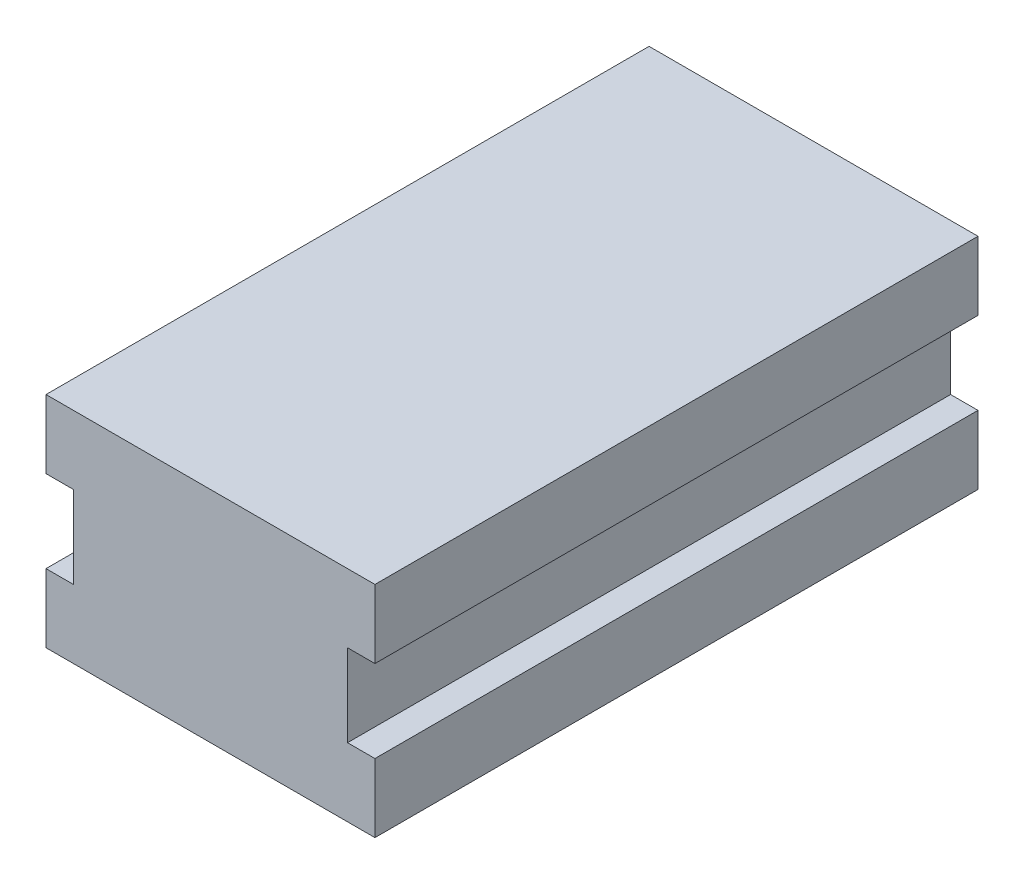
ISO-10303-21;
HEADER;
FILE_DESCRIPTION(('STEP AP214'),'2;1');
FILE_NAME('part.step','',(''),(''),'','','');
FILE_SCHEMA(('AUTOMOTIVE_DESIGN { 1 0 10303 214 1 1 1 1 }'));
ENDSEC;
DATA;
#1=APPLICATION_CONTEXT('core data for automotive mechanical design processes');
#2=APPLICATION_PROTOCOL_DEFINITION('international standard','automotive_design',2000,#1);
#3=PRODUCT_CONTEXT('',#1,'mechanical');
#4=PRODUCT('Part','Part','',(#3));
#5=PRODUCT_RELATED_PRODUCT_CATEGORY('part','',(#4));
#6=PRODUCT_DEFINITION_FORMATION('','',#4);
#7=PRODUCT_DEFINITION_CONTEXT('part definition',#1,'design');
#8=PRODUCT_DEFINITION('design','',#6,#7);
#9=PRODUCT_DEFINITION_SHAPE('','',#8);
#10=(LENGTH_UNIT() NAMED_UNIT(*) SI_UNIT(.MILLI.,.METRE.));
#11=(NAMED_UNIT(*) PLANE_ANGLE_UNIT() SI_UNIT($,.RADIAN.));
#12=(NAMED_UNIT(*) SI_UNIT($,.STERADIAN.) SOLID_ANGLE_UNIT());
#13=UNCERTAINTY_MEASURE_WITH_UNIT(LENGTH_MEASURE(1.E-05),#10,'distance_accuracy_value','');
#14=(GEOMETRIC_REPRESENTATION_CONTEXT(3) GLOBAL_UNCERTAINTY_ASSIGNED_CONTEXT((#13)) GLOBAL_UNIT_ASSIGNED_CONTEXT((#10,
#11,#12)) REPRESENTATION_CONTEXT('',''));
#15=CARTESIAN_POINT('',(0.,0.,0.));
#16=DIRECTION('',(0.,0.,1.));
#17=DIRECTION('',(1.,0.,0.));
#18=AXIS2_PLACEMENT_3D('',#15,#16,#17);
#19=CARTESIAN_POINT('',(0.,2.5,22.));
#20=DIRECTION('',(1.,0.,0.));
#21=DIRECTION('',(0.,1.,0.));
#22=AXIS2_PLACEMENT_3D('',#19,#20,#21);
#23=PLANE('',#22);
#24=DIRECTION('',(0.,-1.,0.));
#25=VECTOR('',#24,1.);
#26=CARTESIAN_POINT('',(0.,2.5,0.));
#27=LINE('',#26,#25);
#28=CARTESIAN_POINT('',(0.,2.5,0.));
#29=VERTEX_POINT('',#28);
#30=CARTESIAN_POINT('',(0.,0.,0.));
#31=VERTEX_POINT('',#30);
#32=EDGE_CURVE('E164',#29,#31,#27,.T.);
#33=ORIENTED_EDGE('',*,*,#32,.T.);
#34=DIRECTION('',(0.,0.,-1.));
#35=VECTOR('',#34,1.);
#36=CARTESIAN_POINT('',(0.,0.,22.));
#37=LINE('',#36,#35);
#38=CARTESIAN_POINT('',(0.,0.,22.));
#39=VERTEX_POINT('',#38);
#40=EDGE_CURVE('E11',#39,#31,#37,.T.);
#41=ORIENTED_EDGE('',*,*,#40,.F.);
#42=DIRECTION('',(0.,-1.,0.));
#43=VECTOR('',#42,1.);
#44=CARTESIAN_POINT('',(0.,2.5,22.));
#45=LINE('',#44,#43);
#46=CARTESIAN_POINT('',(0.,2.5,22.));
#47=VERTEX_POINT('',#46);
#48=EDGE_CURVE('E198',#47,#39,#45,.T.);
#49=ORIENTED_EDGE('',*,*,#48,.F.);
#50=DIRECTION('',(0.,0.,-1.));
#51=VECTOR('',#50,1.);
#52=CARTESIAN_POINT('',(0.,2.5,22.));
#53=LINE('',#52,#51);
#54=EDGE_CURVE('E160',#47,#29,#53,.T.);
#55=ORIENTED_EDGE('',*,*,#54,.T.);
#56=EDGE_LOOP('',(#33,#41,#49,#55));
#57=FACE_BOUND('',#56,.T.);
#58=ADVANCED_FACE('F39',(#57),#23,.F.);
#59=CARTESIAN_POINT('',(0.,0.,22.));
#60=DIRECTION('',(0.,1.,0.));
#61=DIRECTION('',(0.,0.,1.));
#62=AXIS2_PLACEMENT_3D('',#59,#60,#61);
#63=PLANE('',#62);
#64=DIRECTION('',(1.,0.,0.));
#65=VECTOR('',#64,1.);
#66=CARTESIAN_POINT('',(0.,0.,0.));
#67=LINE('',#66,#65);
#68=CARTESIAN_POINT('',(12.,0.,0.));
#69=VERTEX_POINT('',#68);
#70=EDGE_CURVE('E168',#31,#69,#67,.T.);
#71=ORIENTED_EDGE('',*,*,#70,.T.);
#72=DIRECTION('',(0.,0.,-1.));
#73=VECTOR('',#72,1.);
#74=CARTESIAN_POINT('',(12.,0.,22.));
#75=LINE('',#74,#73);
#76=CARTESIAN_POINT('',(12.,0.,22.));
#77=VERTEX_POINT('',#76);
#78=EDGE_CURVE('E48',#77,#69,#75,.T.);
#79=ORIENTED_EDGE('',*,*,#78,.F.);
#80=DIRECTION('',(1.,0.,0.));
#81=VECTOR('',#80,1.);
#82=CARTESIAN_POINT('',(0.,0.,22.));
#83=LINE('',#82,#81);
#84=EDGE_CURVE('E111',#39,#77,#83,.T.);
#85=ORIENTED_EDGE('',*,*,#84,.F.);
#86=ORIENTED_EDGE('',*,*,#40,.T.);
#87=EDGE_LOOP('',(#71,#79,#85,#86));
#88=FACE_BOUND('',#87,.T.);
#89=ADVANCED_FACE('F292',(#88),#63,.F.);
#90=CARTESIAN_POINT('',(12.,2.5,22.));
#91=DIRECTION('',(-1.,0.,0.));
#92=DIRECTION('',(0.,0.,1.));
#93=AXIS2_PLACEMENT_3D('',#90,#91,#92);
#94=PLANE('',#93);
#95=DIRECTION('',(0.,1.,0.));
#96=VECTOR('',#95,1.);
#97=CARTESIAN_POINT('',(12.,2.5,0.));
#98=LINE('',#97,#96);
#99=CARTESIAN_POINT('',(12.,2.5,0.));
#100=VERTEX_POINT('',#99);
#101=EDGE_CURVE('E171',#69,#100,#98,.T.);
#102=ORIENTED_EDGE('',*,*,#101,.T.);
#103=DIRECTION('',(0.,0.,-1.));
#104=VECTOR('',#103,1.);
#105=CARTESIAN_POINT('',(12.,2.5,22.));
#106=LINE('',#105,#104);
#107=CARTESIAN_POINT('',(12.,2.5,22.));
#108=VERTEX_POINT('',#107);
#109=EDGE_CURVE('E225',#108,#100,#106,.T.);
#110=ORIENTED_EDGE('',*,*,#109,.F.);
#111=DIRECTION('',(0.,1.,0.));
#112=VECTOR('',#111,1.);
#113=CARTESIAN_POINT('',(12.,2.5,22.));
#114=LINE('',#113,#112);
#115=EDGE_CURVE('E235',#77,#108,#114,.T.);
#116=ORIENTED_EDGE('',*,*,#115,.F.);
#117=ORIENTED_EDGE('',*,*,#78,.T.);
#118=EDGE_LOOP('',(#102,#110,#116,#117));
#119=FACE_BOUND('',#118,.T.);
#120=ADVANCED_FACE('F233',(#119),#94,.F.);
#121=CARTESIAN_POINT('',(11.,2.5,22.));
#122=DIRECTION('',(0.,-1.,0.));
#123=DIRECTION('',(0.,0.,-1.));
#124=AXIS2_PLACEMENT_3D('',#121,#122,#123);
#125=PLANE('',#124);
#126=DIRECTION('',(-1.,0.,0.));
#127=VECTOR('',#126,1.);
#128=CARTESIAN_POINT('',(11.,2.5,0.));
#129=LINE('',#128,#127);
#130=CARTESIAN_POINT('',(11.,2.5,0.));
#131=VERTEX_POINT('',#130);
#132=EDGE_CURVE('E174',#100,#131,#129,.T.);
#133=ORIENTED_EDGE('',*,*,#132,.T.);
#134=DIRECTION('',(0.,0.,-1.));
#135=VECTOR('',#134,1.);
#136=CARTESIAN_POINT('',(11.,2.5,22.));
#137=LINE('',#136,#135);
#138=CARTESIAN_POINT('',(11.,2.5,22.));
#139=VERTEX_POINT('',#138);
#140=EDGE_CURVE('E221',#139,#131,#137,.T.);
#141=ORIENTED_EDGE('',*,*,#140,.F.);
#142=DIRECTION('',(-1.,0.,0.));
#143=VECTOR('',#142,1.);
#144=CARTESIAN_POINT('',(11.,2.5,22.));
#145=LINE('',#144,#143);
#146=EDGE_CURVE('E254',#108,#139,#145,.T.);
#147=ORIENTED_EDGE('',*,*,#146,.F.);
#148=ORIENTED_EDGE('',*,*,#109,.T.);
#149=EDGE_LOOP('',(#133,#141,#147,#148));
#150=FACE_BOUND('',#149,.T.);
#151=ADVANCED_FACE('F244',(#150),#125,.F.);
#152=CARTESIAN_POINT('',(11.,5.5,22.));
#153=DIRECTION('',(-1.,0.,0.));
#154=DIRECTION('',(0.,0.,1.));
#155=AXIS2_PLACEMENT_3D('',#152,#153,#154);
#156=PLANE('',#155);
#157=DIRECTION('',(0.,1.,0.));
#158=VECTOR('',#157,1.);
#159=CARTESIAN_POINT('',(11.,5.5,0.));
#160=LINE('',#159,#158);
#161=CARTESIAN_POINT('',(11.,5.5,0.));
#162=VERTEX_POINT('',#161);
#163=EDGE_CURVE('E177',#131,#162,#160,.T.);
#164=ORIENTED_EDGE('',*,*,#163,.T.);
#165=DIRECTION('',(0.,0.,-1.));
#166=VECTOR('',#165,1.);
#167=CARTESIAN_POINT('',(11.,5.5,22.));
#168=LINE('',#167,#166);
#169=CARTESIAN_POINT('',(11.,5.5,22.));
#170=VERTEX_POINT('',#169);
#171=EDGE_CURVE('E217',#170,#162,#168,.T.);
#172=ORIENTED_EDGE('',*,*,#171,.F.);
#173=DIRECTION('',(0.,1.,0.));
#174=VECTOR('',#173,1.);
#175=CARTESIAN_POINT('',(11.,5.5,22.));
#176=LINE('',#175,#174);
#177=EDGE_CURVE('E250',#139,#170,#176,.T.);
#178=ORIENTED_EDGE('',*,*,#177,.F.);
#179=ORIENTED_EDGE('',*,*,#140,.T.);
#180=EDGE_LOOP('',(#164,#172,#178,#179));
#181=FACE_BOUND('',#180,.T.);
#182=ADVANCED_FACE('F248',(#181),#156,.F.);
#183=CARTESIAN_POINT('',(12.,5.5,22.));
#184=DIRECTION('',(0.,1.,0.));
#185=DIRECTION('',(0.,0.,1.));
#186=AXIS2_PLACEMENT_3D('',#183,#184,#185);
#187=PLANE('',#186);
#188=DIRECTION('',(1.,0.,0.));
#189=VECTOR('',#188,1.);
#190=CARTESIAN_POINT('',(12.,5.5,0.));
#191=LINE('',#190,#189);
#192=CARTESIAN_POINT('',(12.,5.5,0.));
#193=VERTEX_POINT('',#192);
#194=EDGE_CURVE('E180',#162,#193,#191,.T.);
#195=ORIENTED_EDGE('',*,*,#194,.T.);
#196=DIRECTION('',(0.,0.,-1.));
#197=VECTOR('',#196,1.);
#198=CARTESIAN_POINT('',(12.,5.5,22.));
#199=LINE('',#198,#197);
#200=CARTESIAN_POINT('',(12.,5.5,22.));
#201=VERTEX_POINT('',#200);
#202=EDGE_CURVE('E213',#201,#193,#199,.T.);
#203=ORIENTED_EDGE('',*,*,#202,.F.);
#204=DIRECTION('',(1.,0.,0.));
#205=VECTOR('',#204,1.);
#206=CARTESIAN_POINT('',(12.,5.5,22.));
#207=LINE('',#206,#205);
#208=EDGE_CURVE('E253',#170,#201,#207,.T.);
#209=ORIENTED_EDGE('',*,*,#208,.F.);
#210=ORIENTED_EDGE('',*,*,#171,.T.);
#211=EDGE_LOOP('',(#195,#203,#209,#210));
#212=FACE_BOUND('',#211,.T.);
#213=ADVANCED_FACE('F305',(#212),#187,.F.);
#214=CARTESIAN_POINT('',(12.,8.,22.));
#215=DIRECTION('',(-1.,0.,0.));
#216=DIRECTION('',(0.,0.,1.));
#217=AXIS2_PLACEMENT_3D('',#214,#215,#216);
#218=PLANE('',#217);
#219=DIRECTION('',(0.,1.,0.));
#220=VECTOR('',#219,1.);
#221=CARTESIAN_POINT('',(12.,8.,0.));
#222=LINE('',#221,#220);
#223=CARTESIAN_POINT('',(12.,8.,0.));
#224=VERTEX_POINT('',#223);
#225=EDGE_CURVE('E183',#193,#224,#222,.T.);
#226=ORIENTED_EDGE('',*,*,#225,.T.);
#227=DIRECTION('',(0.,0.,-1.));
#228=VECTOR('',#227,1.);
#229=CARTESIAN_POINT('',(12.,8.,22.));
#230=LINE('',#229,#228);
#231=CARTESIAN_POINT('',(12.,8.,22.));
#232=VERTEX_POINT('',#231);
#233=EDGE_CURVE('E209',#232,#224,#230,.T.);
#234=ORIENTED_EDGE('',*,*,#233,.F.);
#235=DIRECTION('',(0.,1.,0.));
#236=VECTOR('',#235,1.);
#237=CARTESIAN_POINT('',(12.,8.,22.));
#238=LINE('',#237,#236);
#239=EDGE_CURVE('E258',#201,#232,#238,.T.);
#240=ORIENTED_EDGE('',*,*,#239,.F.);
#241=ORIENTED_EDGE('',*,*,#202,.T.);
#242=EDGE_LOOP('',(#226,#234,#240,#241));
#243=FACE_BOUND('',#242,.T.);
#244=ADVANCED_FACE('F308',(#243),#218,.F.);
#245=CARTESIAN_POINT('',(0.,8.,22.));
#246=DIRECTION('',(0.,-1.,0.));
#247=DIRECTION('',(0.,0.,-1.));
#248=AXIS2_PLACEMENT_3D('',#245,#246,#247);
#249=PLANE('',#248);
#250=DIRECTION('',(-1.,0.,0.));
#251=VECTOR('',#250,1.);
#252=CARTESIAN_POINT('',(0.,8.,0.));
#253=LINE('',#252,#251);
#254=CARTESIAN_POINT('',(0.,8.,0.));
#255=VERTEX_POINT('',#254);
#256=EDGE_CURVE('E186',#224,#255,#253,.T.);
#257=ORIENTED_EDGE('',*,*,#256,.T.);
#258=DIRECTION('',(0.,0.,-1.));
#259=VECTOR('',#258,1.);
#260=CARTESIAN_POINT('',(0.,8.,22.));
#261=LINE('',#260,#259);
#262=CARTESIAN_POINT('',(0.,8.,22.));
#263=VERTEX_POINT('',#262);
#264=EDGE_CURVE('E205',#263,#255,#261,.T.);
#265=ORIENTED_EDGE('',*,*,#264,.F.);
#266=DIRECTION('',(-1.,0.,0.));
#267=VECTOR('',#266,1.);
#268=CARTESIAN_POINT('',(0.,8.,22.));
#269=LINE('',#268,#267);
#270=EDGE_CURVE('E265',#232,#263,#269,.T.);
#271=ORIENTED_EDGE('',*,*,#270,.F.);
#272=ORIENTED_EDGE('',*,*,#233,.T.);
#273=EDGE_LOOP('',(#257,#265,#271,#272));
#274=FACE_BOUND('',#273,.T.);
#275=ADVANCED_FACE('F273',(#274),#249,.F.);
#276=CARTESIAN_POINT('',(0.,8.,22.));
#277=DIRECTION('',(1.,0.,0.));
#278=DIRECTION('',(0.,1.,0.));
#279=AXIS2_PLACEMENT_3D('',#276,#277,#278);
#280=PLANE('',#279);
#281=DIRECTION('',(0.,-1.,0.));
#282=VECTOR('',#281,1.);
#283=CARTESIAN_POINT('',(0.,8.,0.));
#284=LINE('',#283,#282);
#285=CARTESIAN_POINT('',(0.,5.5,0.));
#286=VERTEX_POINT('',#285);
#287=EDGE_CURVE('E189',#255,#286,#284,.T.);
#288=ORIENTED_EDGE('',*,*,#287,.T.);
#289=DIRECTION('',(0.,0.,-1.));
#290=VECTOR('',#289,1.);
#291=CARTESIAN_POINT('',(0.,5.5,22.));
#292=LINE('',#291,#290);
#293=CARTESIAN_POINT('',(0.,5.5,22.));
#294=VERTEX_POINT('',#293);
#295=EDGE_CURVE('E153',#294,#286,#292,.T.);
#296=ORIENTED_EDGE('',*,*,#295,.F.);
#297=DIRECTION('',(0.,-1.,0.));
#298=VECTOR('',#297,1.);
#299=CARTESIAN_POINT('',(0.,8.,22.));
#300=LINE('',#299,#298);
#301=EDGE_CURVE('E142',#263,#294,#300,.T.);
#302=ORIENTED_EDGE('',*,*,#301,.F.);
#303=ORIENTED_EDGE('',*,*,#264,.T.);
#304=EDGE_LOOP('',(#288,#296,#302,#303));
#305=FACE_BOUND('',#304,.T.);
#306=ADVANCED_FACE('F277',(#305),#280,.F.);
#307=CARTESIAN_POINT('',(0.,5.5,22.));
#308=DIRECTION('',(0.,1.,0.));
#309=DIRECTION('',(0.,0.,1.));
#310=AXIS2_PLACEMENT_3D('',#307,#308,#309);
#311=PLANE('',#310);
#312=DIRECTION('',(1.,0.,0.));
#313=VECTOR('',#312,1.);
#314=CARTESIAN_POINT('',(0.,5.5,0.));
#315=LINE('',#314,#313);
#316=CARTESIAN_POINT('',(1.,5.5,0.));
#317=VERTEX_POINT('',#316);
#318=EDGE_CURVE('E151',#286,#317,#315,.T.);
#319=ORIENTED_EDGE('',*,*,#318,.T.);
#320=DIRECTION('',(0.,0.,-1.));
#321=VECTOR('',#320,1.);
#322=CARTESIAN_POINT('',(1.,5.5,22.));
#323=LINE('',#322,#321);
#324=CARTESIAN_POINT('',(1.,5.5,22.));
#325=VERTEX_POINT('',#324);
#326=EDGE_CURVE('E148',#325,#317,#323,.T.);
#327=ORIENTED_EDGE('',*,*,#326,.F.);
#328=DIRECTION('',(1.,0.,0.));
#329=VECTOR('',#328,1.);
#330=CARTESIAN_POINT('',(0.,5.5,22.));
#331=LINE('',#330,#329);
#332=EDGE_CURVE('E136',#294,#325,#331,.T.);
#333=ORIENTED_EDGE('',*,*,#332,.F.);
#334=ORIENTED_EDGE('',*,*,#295,.T.);
#335=EDGE_LOOP('',(#319,#327,#333,#334));
#336=FACE_BOUND('',#335,.T.);
#337=ADVANCED_FACE('F149',(#336),#311,.F.);
#338=CARTESIAN_POINT('',(1.,5.5,22.));
#339=DIRECTION('',(1.,0.,0.));
#340=DIRECTION('',(0.,1.,0.));
#341=AXIS2_PLACEMENT_3D('',#338,#339,#340);
#342=PLANE('',#341);
#343=DIRECTION('',(0.,-1.,0.));
#344=VECTOR('',#343,1.);
#345=CARTESIAN_POINT('',(1.,5.5,0.));
#346=LINE('',#345,#344);
#347=CARTESIAN_POINT('',(1.,2.5,0.));
#348=VERTEX_POINT('',#347);
#349=EDGE_CURVE('E97',#317,#348,#346,.T.);
#350=ORIENTED_EDGE('',*,*,#349,.T.);
#351=DIRECTION('',(0.,0.,-1.));
#352=VECTOR('',#351,1.);
#353=CARTESIAN_POINT('',(1.,2.5,22.));
#354=LINE('',#353,#352);
#355=CARTESIAN_POINT('',(1.,2.5,22.));
#356=VERTEX_POINT('',#355);
#357=EDGE_CURVE('E154',#356,#348,#354,.T.);
#358=ORIENTED_EDGE('',*,*,#357,.F.);
#359=DIRECTION('',(0.,-1.,0.));
#360=VECTOR('',#359,1.);
#361=CARTESIAN_POINT('',(1.,5.5,22.));
#362=LINE('',#361,#360);
#363=EDGE_CURVE('E140',#325,#356,#362,.T.);
#364=ORIENTED_EDGE('',*,*,#363,.F.);
#365=ORIENTED_EDGE('',*,*,#326,.T.);
#366=EDGE_LOOP('',(#350,#358,#364,#365));
#367=FACE_BOUND('',#366,.T.);
#368=ADVANCED_FACE('F156',(#367),#342,.F.);
#369=CARTESIAN_POINT('',(1.,2.5,22.));
#370=DIRECTION('',(0.,-1.,0.));
#371=DIRECTION('',(0.,0.,-1.));
#372=AXIS2_PLACEMENT_3D('',#369,#370,#371);
#373=PLANE('',#372);
#374=DIRECTION('',(-1.,0.,0.));
#375=VECTOR('',#374,1.);
#376=CARTESIAN_POINT('',(1.,2.5,0.));
#377=LINE('',#376,#375);
#378=EDGE_CURVE('E103',#348,#29,#377,.T.);
#379=ORIENTED_EDGE('',*,*,#378,.T.);
#380=ORIENTED_EDGE('',*,*,#54,.F.);
#381=DIRECTION('',(-1.,0.,0.));
#382=VECTOR('',#381,1.);
#383=CARTESIAN_POINT('',(1.,2.5,22.));
#384=LINE('',#383,#382);
#385=EDGE_CURVE('E56',#356,#47,#384,.T.);
#386=ORIENTED_EDGE('',*,*,#385,.F.);
#387=ORIENTED_EDGE('',*,*,#357,.T.);
#388=EDGE_LOOP('',(#379,#380,#386,#387));
#389=FACE_BOUND('',#388,.T.);
#390=ADVANCED_FACE('F281',(#389),#373,.F.);
#391=CARTESIAN_POINT('',(0.,0.,22.));
#392=DIRECTION('',(0.,0.,1.));
#393=DIRECTION('',(1.,0.,0.));
#394=AXIS2_PLACEMENT_3D('',#391,#392,#393);
#395=PLANE('',#394);
#396=ORIENTED_EDGE('',*,*,#48,.T.);
#397=ORIENTED_EDGE('',*,*,#84,.T.);
#398=ORIENTED_EDGE('',*,*,#115,.T.);
#399=ORIENTED_EDGE('',*,*,#146,.T.);
#400=ORIENTED_EDGE('',*,*,#177,.T.);
#401=ORIENTED_EDGE('',*,*,#208,.T.);
#402=ORIENTED_EDGE('',*,*,#239,.T.);
#403=ORIENTED_EDGE('',*,*,#270,.T.);
#404=ORIENTED_EDGE('',*,*,#301,.T.);
#405=ORIENTED_EDGE('',*,*,#332,.T.);
#406=ORIENTED_EDGE('',*,*,#363,.T.);
#407=ORIENTED_EDGE('',*,*,#385,.T.);
#408=EDGE_LOOP('',(#396,#397,#398,#399,#400,#401,#402,#403,#404,#405,#406,#407));
#409=FACE_BOUND('',#408,.T.);
#410=ADVANCED_FACE('F138',(#409),#395,.T.);
#411=CARTESIAN_POINT('',(0.,0.,0.));
#412=DIRECTION('',(0.,0.,1.));
#413=DIRECTION('',(1.,0.,0.));
#414=AXIS2_PLACEMENT_3D('',#411,#412,#413);
#415=PLANE('',#414);
#416=ORIENTED_EDGE('',*,*,#32,.F.);
#417=ORIENTED_EDGE('',*,*,#378,.F.);
#418=ORIENTED_EDGE('',*,*,#349,.F.);
#419=ORIENTED_EDGE('',*,*,#318,.F.);
#420=ORIENTED_EDGE('',*,*,#287,.F.);
#421=ORIENTED_EDGE('',*,*,#256,.F.);
#422=ORIENTED_EDGE('',*,*,#225,.F.);
#423=ORIENTED_EDGE('',*,*,#194,.F.);
#424=ORIENTED_EDGE('',*,*,#163,.F.);
#425=ORIENTED_EDGE('',*,*,#132,.F.);
#426=ORIENTED_EDGE('',*,*,#101,.F.);
#427=ORIENTED_EDGE('',*,*,#70,.F.);
#428=EDGE_LOOP('',(#416,#417,#418,#419,#420,#421,#422,#423,#424,#425,#426,#427));
#429=FACE_BOUND('',#428,.T.);
#430=ADVANCED_FACE('F239',(#429),#415,.F.);
#431=CLOSED_SHELL('',(#58,#89,#120,#151,#182,#213,#244,#275,#306,#337,#368,#390,#410,#430));
#432=MANIFOLD_SOLID_BREP('B2',#431);
#433=ADVANCED_BREP_SHAPE_REPRESENTATION('',(#18,#432),#14);
#434=SHAPE_DEFINITION_REPRESENTATION(#9,#433);
ENDSEC;
END-ISO-10303-21;
